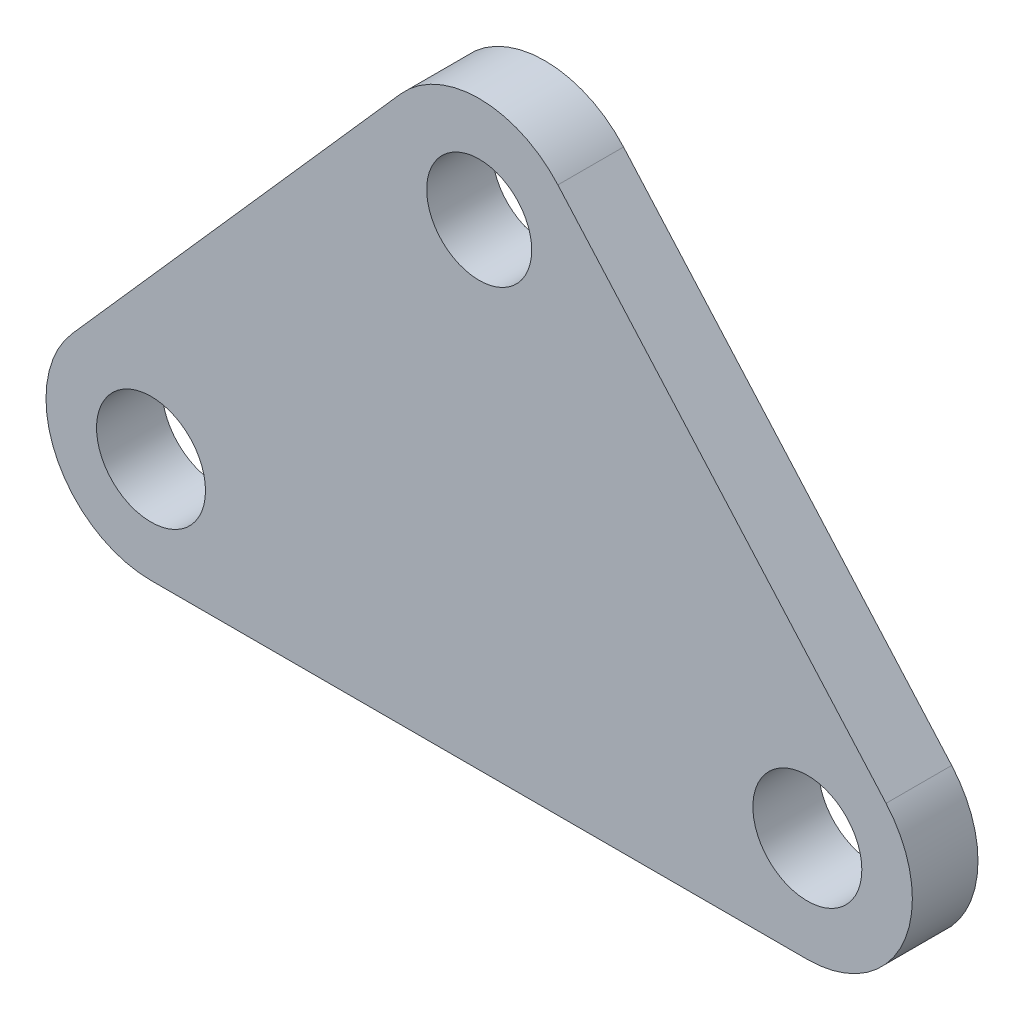
ISO-10303-21;
HEADER;
FILE_DESCRIPTION(('STEP AP214'),'2;1');
FILE_NAME('part.step','',(''),(''),'','','');
FILE_SCHEMA(('AUTOMOTIVE_DESIGN { 1 0 10303 214 1 1 1 1 }'));
ENDSEC;
DATA;
#1=APPLICATION_CONTEXT('core data for automotive mechanical design processes');
#2=APPLICATION_PROTOCOL_DEFINITION('international standard','automotive_design',2000,#1);
#3=PRODUCT_CONTEXT('',#1,'mechanical');
#4=PRODUCT('Part','Part','',(#3));
#5=PRODUCT_RELATED_PRODUCT_CATEGORY('part','',(#4));
#6=PRODUCT_DEFINITION_FORMATION('','',#4);
#7=PRODUCT_DEFINITION_CONTEXT('part definition',#1,'design');
#8=PRODUCT_DEFINITION('design','',#6,#7);
#9=PRODUCT_DEFINITION_SHAPE('','',#8);
#10=(LENGTH_UNIT() NAMED_UNIT(*) SI_UNIT(.MILLI.,.METRE.));
#11=(NAMED_UNIT(*) PLANE_ANGLE_UNIT() SI_UNIT($,.RADIAN.));
#12=(NAMED_UNIT(*) SI_UNIT($,.STERADIAN.) SOLID_ANGLE_UNIT());
#13=UNCERTAINTY_MEASURE_WITH_UNIT(LENGTH_MEASURE(1.E-05),#10,'distance_accuracy_value','');
#14=(GEOMETRIC_REPRESENTATION_CONTEXT(3) GLOBAL_UNCERTAINTY_ASSIGNED_CONTEXT((#13)) GLOBAL_UNIT_ASSIGNED_CONTEXT((#10,
#11,#12)) REPRESENTATION_CONTEXT('',''));
#15=CARTESIAN_POINT('',(0.,0.,0.));
#16=DIRECTION('',(0.,0.,1.));
#17=DIRECTION('',(1.,0.,0.));
#18=AXIS2_PLACEMENT_3D('',#15,#16,#17);
#19=CARTESIAN_POINT('',(25.,-28.3,-5.));
#20=DIRECTION('',(0.,0.,1.));
#21=DIRECTION('',(1.,0.,0.));
#22=AXIS2_PLACEMENT_3D('',#19,#20,#21);
#23=CYLINDRICAL_SURFACE('',#22,8.);
#24=CARTESIAN_POINT('',(25.,-28.3,0.));
#25=DIRECTION('',(0.,0.,1.));
#26=DIRECTION('',(1.,0.,0.));
#27=AXIS2_PLACEMENT_3D('',#24,#25,#26);
#28=CIRCLE('',#27,8.);
#29=CARTESIAN_POINT('',(30.9956104915912,-23.0035243007145,0.));
#30=VERTEX_POINT('',#29);
#31=CARTESIAN_POINT('',(25.,-36.3,0.));
#32=VERTEX_POINT('',#31);
#33=EDGE_CURVE('E127',#30,#32,#28,.F.);
#34=ORIENTED_EDGE('',*,*,#33,.T.);
#35=DIRECTION('',(0.,0.,1.));
#36=VECTOR('',#35,1.);
#37=CARTESIAN_POINT('',(25.,-36.3,-5.));
#38=LINE('',#37,#36);
#39=CARTESIAN_POINT('',(25.,-36.3,-5.));
#40=VERTEX_POINT('',#39);
#41=EDGE_CURVE('E11',#40,#32,#38,.T.);
#42=ORIENTED_EDGE('',*,*,#41,.F.);
#43=CARTESIAN_POINT('',(25.,-28.3,-5.));
#44=DIRECTION('',(0.,0.,1.));
#45=DIRECTION('',(1.,0.,0.));
#46=AXIS2_PLACEMENT_3D('',#43,#44,#45);
#47=CIRCLE('',#46,8.);
#48=CARTESIAN_POINT('',(30.9956104915912,-23.0035243007145,-5.));
#49=VERTEX_POINT('',#48);
#50=EDGE_CURVE('E148',#49,#40,#47,.F.);
#51=ORIENTED_EDGE('',*,*,#50,.F.);
#52=DIRECTION('',(0.,0.,1.));
#53=VECTOR('',#52,1.);
#54=CARTESIAN_POINT('',(30.9956104915912,-23.0035243007145,-5.));
#55=LINE('',#54,#53);
#56=EDGE_CURVE('E38',#49,#30,#55,.T.);
#57=ORIENTED_EDGE('',*,*,#56,.T.);
#58=EDGE_LOOP('',(#34,#42,#51,#57));
#59=FACE_BOUND('',#58,.T.);
#60=ADVANCED_FACE('F35',(#59),#23,.T.);
#61=CARTESIAN_POINT('',(0.,-36.3,-5.));
#62=DIRECTION('',(0.,1.,0.));
#63=DIRECTION('',(-1.,0.,0.));
#64=AXIS2_PLACEMENT_3D('',#61,#62,#63);
#65=PLANE('',#64);
#66=DIRECTION('',(-1.,0.,0.));
#67=VECTOR('',#66,1.);
#68=CARTESIAN_POINT('',(0.,-36.3,0.));
#69=LINE('',#68,#67);
#70=CARTESIAN_POINT('',(-25.,-36.3,0.));
#71=VERTEX_POINT('',#70);
#72=EDGE_CURVE('E80',#32,#71,#69,.T.);
#73=ORIENTED_EDGE('',*,*,#72,.T.);
#74=DIRECTION('',(0.,0.,1.));
#75=VECTOR('',#74,1.);
#76=CARTESIAN_POINT('',(-25.,-36.3,-5.));
#77=LINE('',#76,#75);
#78=CARTESIAN_POINT('',(-25.,-36.3,-5.));
#79=VERTEX_POINT('',#78);
#80=EDGE_CURVE('E44',#79,#71,#77,.T.);
#81=ORIENTED_EDGE('',*,*,#80,.F.);
#82=DIRECTION('',(-1.,0.,0.));
#83=VECTOR('',#82,1.);
#84=CARTESIAN_POINT('',(0.,-36.3,-5.));
#85=LINE('',#84,#83);
#86=EDGE_CURVE('E52',#40,#79,#85,.T.);
#87=ORIENTED_EDGE('',*,*,#86,.F.);
#88=ORIENTED_EDGE('',*,*,#41,.T.);
#89=EDGE_LOOP('',(#73,#81,#87,#88));
#90=FACE_BOUND('',#89,.T.);
#91=ADVANCED_FACE('F174',(#90),#65,.F.);
#92=CARTESIAN_POINT('',(-25.,-28.3,-5.));
#93=DIRECTION('',(0.,0.,1.));
#94=DIRECTION('',(1.,0.,0.));
#95=AXIS2_PLACEMENT_3D('',#92,#93,#94);
#96=CYLINDRICAL_SURFACE('',#95,8.);
#97=CARTESIAN_POINT('',(-25.,-28.3,0.));
#98=DIRECTION('',(0.,0.,1.));
#99=DIRECTION('',(1.,0.,0.));
#100=AXIS2_PLACEMENT_3D('',#97,#98,#99);
#101=CIRCLE('',#100,8.);
#102=CARTESIAN_POINT('',(-30.9956104915912,-23.0035243007145,0.));
#103=VERTEX_POINT('',#102);
#104=EDGE_CURVE('E99',#103,#71,#101,.T.);
#105=ORIENTED_EDGE('',*,*,#104,.F.);
#106=DIRECTION('',(0.,0.,1.));
#107=VECTOR('',#106,1.);
#108=CARTESIAN_POINT('',(-30.9956104915912,-23.0035243007145,-5.));
#109=LINE('',#108,#107);
#110=CARTESIAN_POINT('',(-30.9956104915912,-23.0035243007145,-5.));
#111=VERTEX_POINT('',#110);
#112=EDGE_CURVE('E94',#111,#103,#109,.T.);
#113=ORIENTED_EDGE('',*,*,#112,.F.);
#114=CARTESIAN_POINT('',(-25.,-28.3,-5.));
#115=DIRECTION('',(0.,0.,1.));
#116=DIRECTION('',(1.,0.,0.));
#117=AXIS2_PLACEMENT_3D('',#114,#115,#116);
#118=CIRCLE('',#117,8.);
#119=EDGE_CURVE('E98',#111,#79,#118,.T.);
#120=ORIENTED_EDGE('',*,*,#119,.T.);
#121=ORIENTED_EDGE('',*,*,#80,.T.);
#122=EDGE_LOOP('',(#105,#113,#120,#121));
#123=FACE_BOUND('',#122,.T.);
#124=ADVANCED_FACE('F96',(#123),#96,.T.);
#125=CARTESIAN_POINT('',(-5.99561049159118,5.29647569928549,-5.));
#126=DIRECTION('',(0.749451311448898,-0.662059462410687,0.));
#127=DIRECTION('',(0.662059462410687,0.749451311448898,0.));
#128=AXIS2_PLACEMENT_3D('',#125,#126,#127);
#129=PLANE('',#128);
#130=DIRECTION('',(0.662059462410687,0.749451311448898,0.));
#131=VECTOR('',#130,1.);
#132=CARTESIAN_POINT('',(-5.99561049159118,5.29647569928549,0.));
#133=LINE('',#132,#131);
#134=CARTESIAN_POINT('',(-5.99561049159118,5.2964756992855,0.));
#135=VERTEX_POINT('',#134);
#136=EDGE_CURVE('E136',#103,#135,#133,.T.);
#137=ORIENTED_EDGE('',*,*,#136,.T.);
#138=DIRECTION('',(0.,0.,1.));
#139=VECTOR('',#138,1.);
#140=CARTESIAN_POINT('',(-5.99561049159118,5.2964756992855,-5.));
#141=LINE('',#140,#139);
#142=CARTESIAN_POINT('',(-5.99561049159118,5.2964756992855,-5.));
#143=VERTEX_POINT('',#142);
#144=EDGE_CURVE('E102',#143,#135,#141,.T.);
#145=ORIENTED_EDGE('',*,*,#144,.F.);
#146=DIRECTION('',(0.662059462410687,0.749451311448898,0.));
#147=VECTOR('',#146,1.);
#148=CARTESIAN_POINT('',(-5.99561049159118,5.29647569928549,-5.));
#149=LINE('',#148,#147);
#150=EDGE_CURVE('E105',#111,#143,#149,.T.);
#151=ORIENTED_EDGE('',*,*,#150,.F.);
#152=ORIENTED_EDGE('',*,*,#112,.T.);
#153=EDGE_LOOP('',(#137,#145,#151,#152));
#154=FACE_BOUND('',#153,.T.);
#155=ADVANCED_FACE('F106',(#154),#129,.F.);
#156=CARTESIAN_POINT('',(0.,0.,-5.));
#157=DIRECTION('',(0.,0.,1.));
#158=DIRECTION('',(1.,0.,0.));
#159=AXIS2_PLACEMENT_3D('',#156,#157,#158);
#160=CYLINDRICAL_SURFACE('',#159,8.00000000000001);
#161=CARTESIAN_POINT('',(0.,0.,0.));
#162=DIRECTION('',(0.,0.,1.));
#163=DIRECTION('',(1.,0.,0.));
#164=AXIS2_PLACEMENT_3D('',#161,#162,#163);
#165=CIRCLE('',#164,8.00000000000001);
#166=CARTESIAN_POINT('',(5.99561049159119,5.2964756992855,0.));
#167=VERTEX_POINT('',#166);
#168=EDGE_CURVE('E133',#135,#167,#165,.F.);
#169=ORIENTED_EDGE('',*,*,#168,.T.);
#170=DIRECTION('',(0.,0.,1.));
#171=VECTOR('',#170,1.);
#172=CARTESIAN_POINT('',(5.99561049159119,5.2964756992855,-5.));
#173=LINE('',#172,#171);
#174=CARTESIAN_POINT('',(5.99561049159119,5.2964756992855,-5.));
#175=VERTEX_POINT('',#174);
#176=EDGE_CURVE('E151',#175,#167,#173,.T.);
#177=ORIENTED_EDGE('',*,*,#176,.F.);
#178=CARTESIAN_POINT('',(0.,0.,-5.));
#179=DIRECTION('',(0.,0.,1.));
#180=DIRECTION('',(1.,0.,0.));
#181=AXIS2_PLACEMENT_3D('',#178,#179,#180);
#182=CIRCLE('',#181,8.00000000000001);
#183=EDGE_CURVE('E110',#143,#175,#182,.F.);
#184=ORIENTED_EDGE('',*,*,#183,.F.);
#185=ORIENTED_EDGE('',*,*,#144,.T.);
#186=EDGE_LOOP('',(#169,#177,#184,#185));
#187=FACE_BOUND('',#186,.T.);
#188=ADVANCED_FACE('F186',(#187),#160,.T.);
#189=CARTESIAN_POINT('',(-25.,-28.3,-5.));
#190=DIRECTION('',(0.,0.,1.));
#191=DIRECTION('',(1.,0.,0.));
#192=AXIS2_PLACEMENT_3D('',#189,#190,#191);
#193=CYLINDRICAL_SURFACE('',#192,4.15);
#194=CARTESIAN_POINT('',(-25.,-28.3,-5.));
#195=DIRECTION('',(0.,0.,1.));
#196=DIRECTION('',(1.,0.,0.));
#197=AXIS2_PLACEMENT_3D('',#194,#195,#196);
#198=CIRCLE('',#197,4.15);
#199=CARTESIAN_POINT('',(-20.85,-28.3,-5.));
#200=VERTEX_POINT('',#199);
#201=EDGE_CURVE('E121',#200,#200,#198,.T.);
#202=ORIENTED_EDGE('',*,*,#201,.F.);
#203=EDGE_LOOP('',(#202));
#204=FACE_BOUND('',#203,.T.);
#205=CARTESIAN_POINT('',(-25.,-28.3,0.));
#206=DIRECTION('',(0.,0.,1.));
#207=DIRECTION('',(1.,0.,0.));
#208=AXIS2_PLACEMENT_3D('',#205,#206,#207);
#209=CIRCLE('',#208,4.15);
#210=CARTESIAN_POINT('',(-20.85,-28.3,0.));
#211=VERTEX_POINT('',#210);
#212=EDGE_CURVE('E143',#211,#211,#209,.T.);
#213=ORIENTED_EDGE('',*,*,#212,.T.);
#214=EDGE_LOOP('',(#213));
#215=FACE_BOUND('',#214,.T.);
#216=ADVANCED_FACE('F169',(#204,#215),#193,.F.);
#217=CARTESIAN_POINT('',(0.,0.,-5.));
#218=DIRECTION('',(0.,0.,1.));
#219=DIRECTION('',(1.,0.,0.));
#220=AXIS2_PLACEMENT_3D('',#217,#218,#219);
#221=CYLINDRICAL_SURFACE('',#220,4.);
#222=CARTESIAN_POINT('',(0.,0.,-5.));
#223=DIRECTION('',(0.,0.,1.));
#224=DIRECTION('',(1.,0.,0.));
#225=AXIS2_PLACEMENT_3D('',#222,#223,#224);
#226=CIRCLE('',#225,4.);
#227=CARTESIAN_POINT('',(4.,0.,-5.));
#228=VERTEX_POINT('',#227);
#229=EDGE_CURVE('E115',#228,#228,#226,.T.);
#230=ORIENTED_EDGE('',*,*,#229,.F.);
#231=EDGE_LOOP('',(#230));
#232=FACE_BOUND('',#231,.T.);
#233=CARTESIAN_POINT('',(0.,0.,0.));
#234=DIRECTION('',(0.,0.,1.));
#235=DIRECTION('',(1.,0.,0.));
#236=AXIS2_PLACEMENT_3D('',#233,#234,#235);
#237=CIRCLE('',#236,4.);
#238=CARTESIAN_POINT('',(4.,0.,0.));
#239=VERTEX_POINT('',#238);
#240=EDGE_CURVE('E140',#239,#239,#237,.T.);
#241=ORIENTED_EDGE('',*,*,#240,.T.);
#242=EDGE_LOOP('',(#241));
#243=FACE_BOUND('',#242,.T.);
#244=ADVANCED_FACE('F162',(#232,#243),#221,.F.);
#245=CARTESIAN_POINT('',(5.99561049159119,5.2964756992855,-5.));
#246=DIRECTION('',(0.749451311448898,0.662059462410687,0.));
#247=DIRECTION('',(-0.662059462410687,0.749451311448898,0.));
#248=AXIS2_PLACEMENT_3D('',#245,#246,#247);
#249=PLANE('',#248);
#250=DIRECTION('',(-0.662059462410687,0.749451311448898,0.));
#251=VECTOR('',#250,1.);
#252=CARTESIAN_POINT('',(5.99561049159119,5.2964756992855,0.));
#253=LINE('',#252,#251);
#254=EDGE_CURVE('E130',#30,#167,#253,.T.);
#255=ORIENTED_EDGE('',*,*,#254,.F.);
#256=ORIENTED_EDGE('',*,*,#56,.F.);
#257=DIRECTION('',(-0.662059462410687,0.749451311448898,0.));
#258=VECTOR('',#257,1.);
#259=CARTESIAN_POINT('',(5.99561049159119,5.2964756992855,-5.));
#260=LINE('',#259,#258);
#261=EDGE_CURVE('E193',#49,#175,#260,.T.);
#262=ORIENTED_EDGE('',*,*,#261,.T.);
#263=ORIENTED_EDGE('',*,*,#176,.T.);
#264=EDGE_LOOP('',(#255,#256,#262,#263));
#265=FACE_BOUND('',#264,.T.);
#266=ADVANCED_FACE('F159',(#265),#249,.T.);
#267=CARTESIAN_POINT('',(25.,-28.3,-5.));
#268=DIRECTION('',(0.,0.,1.));
#269=DIRECTION('',(1.,0.,0.));
#270=AXIS2_PLACEMENT_3D('',#267,#268,#269);
#271=CYLINDRICAL_SURFACE('',#270,4.15);
#272=CARTESIAN_POINT('',(25.,-28.3,-5.));
#273=DIRECTION('',(0.,0.,1.));
#274=DIRECTION('',(1.,0.,0.));
#275=AXIS2_PLACEMENT_3D('',#272,#273,#274);
#276=CIRCLE('',#275,4.15);
#277=CARTESIAN_POINT('',(29.15,-28.3,-5.));
#278=VERTEX_POINT('',#277);
#279=EDGE_CURVE('E124',#278,#278,#276,.F.);
#280=ORIENTED_EDGE('',*,*,#279,.T.);
#281=EDGE_LOOP('',(#280));
#282=FACE_BOUND('',#281,.T.);
#283=CARTESIAN_POINT('',(25.,-28.3,0.));
#284=DIRECTION('',(0.,0.,1.));
#285=DIRECTION('',(1.,0.,0.));
#286=AXIS2_PLACEMENT_3D('',#283,#284,#285);
#287=CIRCLE('',#286,4.15);
#288=CARTESIAN_POINT('',(29.15,-28.3,0.));
#289=VERTEX_POINT('',#288);
#290=EDGE_CURVE('E146',#289,#289,#287,.F.);
#291=ORIENTED_EDGE('',*,*,#290,.F.);
#292=EDGE_LOOP('',(#291));
#293=FACE_BOUND('',#292,.T.);
#294=ADVANCED_FACE('F161',(#282,#293),#271,.F.);
#295=CARTESIAN_POINT('',(0.,0.,-5.));
#296=DIRECTION('',(0.,0.,1.));
#297=DIRECTION('',(1.,0.,0.));
#298=AXIS2_PLACEMENT_3D('',#295,#296,#297);
#299=PLANE('',#298);
#300=ORIENTED_EDGE('',*,*,#50,.T.);
#301=ORIENTED_EDGE('',*,*,#86,.T.);
#302=ORIENTED_EDGE('',*,*,#119,.F.);
#303=ORIENTED_EDGE('',*,*,#150,.T.);
#304=ORIENTED_EDGE('',*,*,#183,.T.);
#305=ORIENTED_EDGE('',*,*,#261,.F.);
#306=EDGE_LOOP('',(#300,#301,#302,#303,#304,#305));
#307=FACE_BOUND('',#306,.T.);
#308=ORIENTED_EDGE('',*,*,#229,.T.);
#309=EDGE_LOOP('',(#308));
#310=FACE_BOUND('',#309,.T.);
#311=ORIENTED_EDGE('',*,*,#201,.T.);
#312=EDGE_LOOP('',(#311));
#313=FACE_BOUND('',#312,.T.);
#314=ORIENTED_EDGE('',*,*,#279,.F.);
#315=EDGE_LOOP('',(#314));
#316=FACE_BOUND('',#315,.T.);
#317=ADVANCED_FACE('F112',(#307,#310,#313,#316),#299,.F.);
#318=CARTESIAN_POINT('',(0.,0.,0.));
#319=DIRECTION('',(0.,0.,1.));
#320=DIRECTION('',(1.,0.,0.));
#321=AXIS2_PLACEMENT_3D('',#318,#319,#320);
#322=PLANE('',#321);
#323=ORIENTED_EDGE('',*,*,#33,.F.);
#324=ORIENTED_EDGE('',*,*,#254,.T.);
#325=ORIENTED_EDGE('',*,*,#168,.F.);
#326=ORIENTED_EDGE('',*,*,#136,.F.);
#327=ORIENTED_EDGE('',*,*,#104,.T.);
#328=ORIENTED_EDGE('',*,*,#72,.F.);
#329=EDGE_LOOP('',(#323,#324,#325,#326,#327,#328));
#330=FACE_BOUND('',#329,.T.);
#331=ORIENTED_EDGE('',*,*,#240,.F.);
#332=EDGE_LOOP('',(#331));
#333=FACE_BOUND('',#332,.T.);
#334=ORIENTED_EDGE('',*,*,#212,.F.);
#335=EDGE_LOOP('',(#334));
#336=FACE_BOUND('',#335,.T.);
#337=ORIENTED_EDGE('',*,*,#290,.T.);
#338=EDGE_LOOP('',(#337));
#339=FACE_BOUND('',#338,.T.);
#340=ADVANCED_FACE('F156',(#330,#333,#336,#339),#322,.T.);
#341=CLOSED_SHELL('',(#60,#91,#124,#155,#188,#216,#244,#266,#294,#317,#340));
#342=MANIFOLD_SOLID_BREP('B2',#341);
#343=ADVANCED_BREP_SHAPE_REPRESENTATION('',(#18,#342),#14);
#344=SHAPE_DEFINITION_REPRESENTATION(#9,#343);
ENDSEC;
END-ISO-10303-21;
